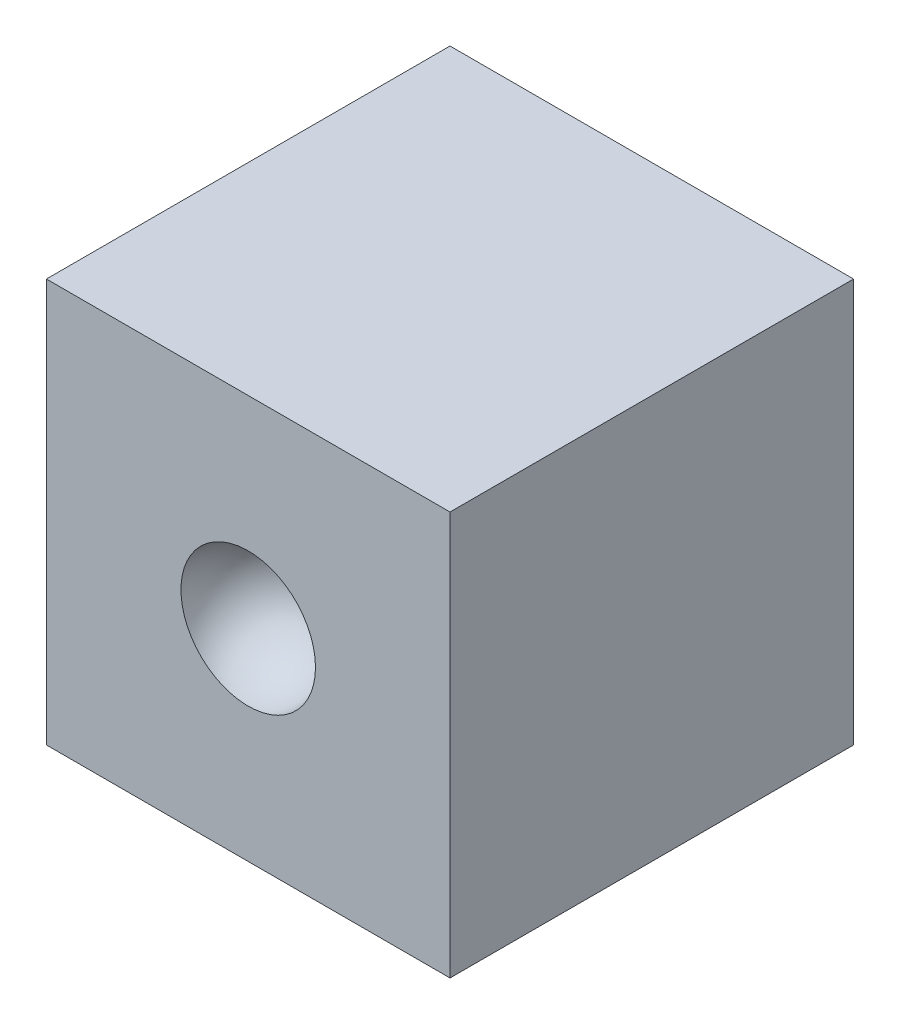
ISO-10303-21;
HEADER;
FILE_DESCRIPTION(('STEP AP214'),'2;1');
FILE_NAME('part.step','',(''),(''),'','','');
FILE_SCHEMA(('AUTOMOTIVE_DESIGN { 1 0 10303 214 1 1 1 1 }'));
ENDSEC;
DATA;
#1=APPLICATION_CONTEXT('core data for automotive mechanical design processes');
#2=APPLICATION_PROTOCOL_DEFINITION('international standard','automotive_design',2000,#1);
#3=PRODUCT_CONTEXT('',#1,'mechanical');
#4=PRODUCT('Part','Part','',(#3));
#5=PRODUCT_RELATED_PRODUCT_CATEGORY('part','',(#4));
#6=PRODUCT_DEFINITION_FORMATION('','',#4);
#7=PRODUCT_DEFINITION_CONTEXT('part definition',#1,'design');
#8=PRODUCT_DEFINITION('design','',#6,#7);
#9=PRODUCT_DEFINITION_SHAPE('','',#8);
#10=(LENGTH_UNIT() NAMED_UNIT(*) SI_UNIT(.MILLI.,.METRE.));
#11=(NAMED_UNIT(*) PLANE_ANGLE_UNIT() SI_UNIT($,.RADIAN.));
#12=(NAMED_UNIT(*) SI_UNIT($,.STERADIAN.) SOLID_ANGLE_UNIT());
#13=UNCERTAINTY_MEASURE_WITH_UNIT(LENGTH_MEASURE(1.E-05),#10,'distance_accuracy_value','');
#14=(GEOMETRIC_REPRESENTATION_CONTEXT(3) GLOBAL_UNCERTAINTY_ASSIGNED_CONTEXT((#13)) GLOBAL_UNIT_ASSIGNED_CONTEXT((#10,
#11,#12)) REPRESENTATION_CONTEXT('',''));
#15=CARTESIAN_POINT('',(0.,0.,0.));
#16=DIRECTION('',(0.,0.,1.));
#17=DIRECTION('',(1.,0.,0.));
#18=AXIS2_PLACEMENT_3D('',#15,#16,#17);
#19=CARTESIAN_POINT('',(9.,-9.,18.));
#20=DIRECTION('',(-1.,0.,0.));
#21=DIRECTION('',(0.,0.,1.));
#22=AXIS2_PLACEMENT_3D('',#19,#20,#21);
#23=PLANE('',#22);
#24=DIRECTION('',(0.,1.,0.));
#25=VECTOR('',#24,1.);
#26=CARTESIAN_POINT('',(9.,-9.,0.));
#27=LINE('',#26,#25);
#28=CARTESIAN_POINT('',(9.,-9.,0.));
#29=VERTEX_POINT('',#28);
#30=CARTESIAN_POINT('',(9.,9.,0.));
#31=VERTEX_POINT('',#30);
#32=EDGE_CURVE('E115',#29,#31,#27,.T.);
#33=ORIENTED_EDGE('',*,*,#32,.T.);
#34=DIRECTION('',(0.,0.,-1.));
#35=VECTOR('',#34,1.);
#36=CARTESIAN_POINT('',(9.,9.,18.));
#37=LINE('',#36,#35);
#38=CARTESIAN_POINT('',(9.,9.,18.));
#39=VERTEX_POINT('',#38);
#40=EDGE_CURVE('E11',#39,#31,#37,.T.);
#41=ORIENTED_EDGE('',*,*,#40,.F.);
#42=DIRECTION('',(0.,1.,0.));
#43=VECTOR('',#42,1.);
#44=CARTESIAN_POINT('',(9.,-9.,18.));
#45=LINE('',#44,#43);
#46=CARTESIAN_POINT('',(9.,-9.,18.));
#47=VERTEX_POINT('',#46);
#48=EDGE_CURVE('E96',#47,#39,#45,.T.);
#49=ORIENTED_EDGE('',*,*,#48,.F.);
#50=DIRECTION('',(0.,0.,-1.));
#51=VECTOR('',#50,1.);
#52=CARTESIAN_POINT('',(9.,-9.,18.));
#53=LINE('',#52,#51);
#54=EDGE_CURVE('E63',#47,#29,#53,.T.);
#55=ORIENTED_EDGE('',*,*,#54,.T.);
#56=EDGE_LOOP('',(#33,#41,#49,#55));
#57=FACE_BOUND('',#56,.T.);
#58=ADVANCED_FACE('F45',(#57),#23,.F.);
#59=CARTESIAN_POINT('',(9.,9.,18.));
#60=DIRECTION('',(0.,-1.,0.));
#61=DIRECTION('',(1.,0.,0.));
#62=AXIS2_PLACEMENT_3D('',#59,#60,#61);
#63=PLANE('',#62);
#64=DIRECTION('',(-1.,0.,0.));
#65=VECTOR('',#64,1.);
#66=CARTESIAN_POINT('',(9.,9.,0.));
#67=LINE('',#66,#65);
#68=CARTESIAN_POINT('',(-9.,9.,0.));
#69=VERTEX_POINT('',#68);
#70=EDGE_CURVE('E102',#31,#69,#67,.T.);
#71=ORIENTED_EDGE('',*,*,#70,.T.);
#72=DIRECTION('',(0.,0.,-1.));
#73=VECTOR('',#72,1.);
#74=CARTESIAN_POINT('',(-9.,9.,18.));
#75=LINE('',#74,#73);
#76=CARTESIAN_POINT('',(-9.,9.,18.));
#77=VERTEX_POINT('',#76);
#78=EDGE_CURVE('E55',#77,#69,#75,.T.);
#79=ORIENTED_EDGE('',*,*,#78,.F.);
#80=DIRECTION('',(-1.,0.,0.));
#81=VECTOR('',#80,1.);
#82=CARTESIAN_POINT('',(9.,9.,18.));
#83=LINE('',#82,#81);
#84=EDGE_CURVE('E88',#39,#77,#83,.T.);
#85=ORIENTED_EDGE('',*,*,#84,.F.);
#86=ORIENTED_EDGE('',*,*,#40,.T.);
#87=EDGE_LOOP('',(#71,#79,#85,#86));
#88=FACE_BOUND('',#87,.T.);
#89=ADVANCED_FACE('F101',(#88),#63,.F.);
#90=CARTESIAN_POINT('',(-9.,-9.,18.));
#91=DIRECTION('',(-1.,0.,0.));
#92=DIRECTION('',(0.,-1.,0.));
#93=AXIS2_PLACEMENT_3D('',#90,#91,#92);
#94=PLANE('',#93);
#95=DIRECTION('',(0.,1.,0.));
#96=VECTOR('',#95,1.);
#97=CARTESIAN_POINT('',(-9.,-9.,0.));
#98=LINE('',#97,#96);
#99=CARTESIAN_POINT('',(-9.,-9.,0.));
#100=VERTEX_POINT('',#99);
#101=EDGE_CURVE('E120',#100,#69,#98,.T.);
#102=ORIENTED_EDGE('',*,*,#101,.F.);
#103=DIRECTION('',(0.,0.,-1.));
#104=VECTOR('',#103,1.);
#105=CARTESIAN_POINT('',(-9.,-9.,18.));
#106=LINE('',#105,#104);
#107=CARTESIAN_POINT('',(-9.,-9.,18.));
#108=VERTEX_POINT('',#107);
#109=EDGE_CURVE('E77',#108,#100,#106,.T.);
#110=ORIENTED_EDGE('',*,*,#109,.F.);
#111=DIRECTION('',(0.,1.,0.));
#112=VECTOR('',#111,1.);
#113=CARTESIAN_POINT('',(-9.,-9.,18.));
#114=LINE('',#113,#112);
#115=EDGE_CURVE('E95',#108,#77,#114,.T.);
#116=ORIENTED_EDGE('',*,*,#115,.T.);
#117=ORIENTED_EDGE('',*,*,#78,.T.);
#118=EDGE_LOOP('',(#102,#110,#116,#117));
#119=FACE_BOUND('',#118,.T.);
#120=ADVANCED_FACE('F107',(#119),#94,.T.);
#121=CARTESIAN_POINT('',(9.,-9.,18.));
#122=DIRECTION('',(0.,-1.,0.));
#123=DIRECTION('',(0.,0.,-1.));
#124=AXIS2_PLACEMENT_3D('',#121,#122,#123);
#125=PLANE('',#124);
#126=DIRECTION('',(-1.,0.,0.));
#127=VECTOR('',#126,1.);
#128=CARTESIAN_POINT('',(9.,-9.,0.));
#129=LINE('',#128,#127);
#130=EDGE_CURVE('E123',#29,#100,#129,.T.);
#131=ORIENTED_EDGE('',*,*,#130,.F.);
#132=ORIENTED_EDGE('',*,*,#54,.F.);
#133=DIRECTION('',(-1.,0.,0.));
#134=VECTOR('',#133,1.);
#135=CARTESIAN_POINT('',(9.,-9.,18.));
#136=LINE('',#135,#134);
#137=EDGE_CURVE('E109',#47,#108,#136,.T.);
#138=ORIENTED_EDGE('',*,*,#137,.T.);
#139=ORIENTED_EDGE('',*,*,#109,.T.);
#140=EDGE_LOOP('',(#131,#132,#138,#139));
#141=FACE_BOUND('',#140,.T.);
#142=ADVANCED_FACE('F133',(#141),#125,.T.);
#143=CARTESIAN_POINT('',(0.,0.,18.));
#144=DIRECTION('',(0.,0.,1.));
#145=DIRECTION('',(1.,0.,0.));
#146=AXIS2_PLACEMENT_3D('',#143,#144,#145);
#147=PLANE('',#146);
#148=CARTESIAN_POINT('',(0.,0.,18.));
#149=DIRECTION('',(0.,0.,1.));
#150=DIRECTION('',(1.,0.,0.));
#151=AXIS2_PLACEMENT_3D('',#148,#149,#150);
#152=CIRCLE('',#151,3.);
#153=CARTESIAN_POINT('',(3.,0.,18.));
#154=VERTEX_POINT('',#153);
#155=EDGE_CURVE('E48',#154,#154,#152,.T.);
#156=ORIENTED_EDGE('',*,*,#155,.F.);
#157=EDGE_LOOP('',(#156));
#158=FACE_BOUND('',#157,.T.);
#159=ORIENTED_EDGE('',*,*,#48,.T.);
#160=ORIENTED_EDGE('',*,*,#84,.T.);
#161=ORIENTED_EDGE('',*,*,#115,.F.);
#162=ORIENTED_EDGE('',*,*,#137,.F.);
#163=EDGE_LOOP('',(#159,#160,#161,#162));
#164=FACE_BOUND('',#163,.T.);
#165=ADVANCED_FACE('F92',(#158,#164),#147,.T.);
#166=CARTESIAN_POINT('',(0.,0.,0.));
#167=DIRECTION('',(0.,0.,1.));
#168=DIRECTION('',(1.,0.,0.));
#169=AXIS2_PLACEMENT_3D('',#166,#167,#168);
#170=PLANE('',#169);
#171=ORIENTED_EDGE('',*,*,#32,.F.);
#172=ORIENTED_EDGE('',*,*,#130,.T.);
#173=ORIENTED_EDGE('',*,*,#101,.T.);
#174=ORIENTED_EDGE('',*,*,#70,.F.);
#175=EDGE_LOOP('',(#171,#172,#173,#174));
#176=FACE_BOUND('',#175,.T.);
#177=ADVANCED_FACE('F132',(#176),#170,.F.);
#178=CARTESIAN_POINT('',(0.,0.,18.));
#179=DIRECTION('',(0.,1.,0.));
#180=DIRECTION('',(1.,0.,0.));
#181=AXIS2_PLACEMENT_3D('',#178,#179,#180);
#182=SPHERICAL_SURFACE('',#181,3.);
#183=CARTESIAN_POINT('',(0.,0.,18.));
#184=DIRECTION('',(0.,0.,1.));
#185=DIRECTION('',(1.,0.,0.));
#186=AXIS2_PLACEMENT_3D('',#183,#184,#185);
#187=SPHERICAL_SURFACE('',#186,3.);
#188=ORIENTED_EDGE('',*,*,#155,.T.);
#189=EDGE_LOOP('',(#188));
#190=FACE_BOUND('',#189,.T.);
#191=ADVANCED_FACE('F176',(#190),#187,.F.);
#192=CLOSED_SHELL('',(#58,#89,#120,#142,#165,#177,#191));
#193=MANIFOLD_SOLID_BREP('B2',#192);
#194=ADVANCED_BREP_SHAPE_REPRESENTATION('',(#18,#193),#14);
#195=SHAPE_DEFINITION_REPRESENTATION(#9,#194);
ENDSEC;
END-ISO-10303-21;
